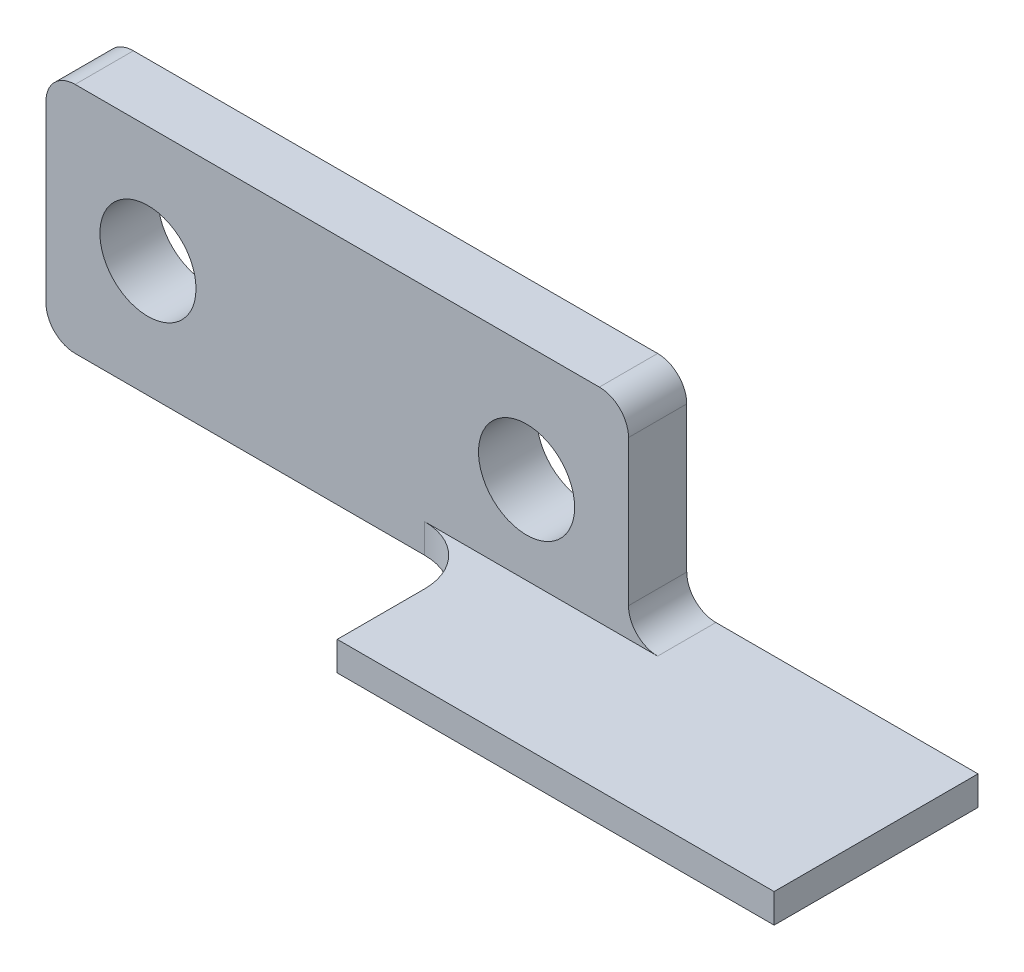
ISO-10303-21;
HEADER;
FILE_DESCRIPTION(('STEP AP214'),'2;1');
FILE_NAME('part.step','',(''),(''),'','','');
FILE_SCHEMA(('AUTOMOTIVE_DESIGN { 1 0 10303 214 1 1 1 1 }'));
ENDSEC;
DATA;
#1=APPLICATION_CONTEXT('core data for automotive mechanical design processes');
#2=APPLICATION_PROTOCOL_DEFINITION('international standard','automotive_design',2000,#1);
#3=PRODUCT_CONTEXT('',#1,'mechanical');
#4=PRODUCT('Part','Part','',(#3));
#5=PRODUCT_RELATED_PRODUCT_CATEGORY('part','',(#4));
#6=PRODUCT_DEFINITION_FORMATION('','',#4);
#7=PRODUCT_DEFINITION_CONTEXT('part definition',#1,'design');
#8=PRODUCT_DEFINITION('design','',#6,#7);
#9=PRODUCT_DEFINITION_SHAPE('','',#8);
#10=(LENGTH_UNIT() NAMED_UNIT(*) SI_UNIT(.MILLI.,.METRE.));
#11=(NAMED_UNIT(*) PLANE_ANGLE_UNIT() SI_UNIT($,.RADIAN.));
#12=(NAMED_UNIT(*) SI_UNIT($,.STERADIAN.) SOLID_ANGLE_UNIT());
#13=UNCERTAINTY_MEASURE_WITH_UNIT(LENGTH_MEASURE(1.E-05),#10,'distance_accuracy_value','');
#14=(GEOMETRIC_REPRESENTATION_CONTEXT(3) GLOBAL_UNCERTAINTY_ASSIGNED_CONTEXT((#13)) GLOBAL_UNIT_ASSIGNED_CONTEXT((#10,
#11,#12)) REPRESENTATION_CONTEXT('',''));
#15=CARTESIAN_POINT('',(0.,0.,0.));
#16=DIRECTION('',(0.,0.,1.));
#17=DIRECTION('',(1.,0.,0.));
#18=AXIS2_PLACEMENT_3D('',#15,#16,#17);
#19=CARTESIAN_POINT('',(0.,0.,2.));
#20=DIRECTION('',(1.,0.,0.));
#21=DIRECTION('',(0.,0.,-1.));
#22=AXIS2_PLACEMENT_3D('',#19,#20,#21);
#23=PLANE('',#22);
#24=DIRECTION('',(0.,-1.,0.));
#25=VECTOR('',#24,1.);
#26=CARTESIAN_POINT('',(0.,0.,2.));
#27=LINE('',#26,#25);
#28=CARTESIAN_POINT('',(0.,7.,2.));
#29=VERTEX_POINT('',#28);
#30=CARTESIAN_POINT('',(0.,1.,2.));
#31=VERTEX_POINT('',#30);
#32=EDGE_CURVE('E168',#29,#31,#27,.T.);
#33=ORIENTED_EDGE('',*,*,#32,.F.);
#34=DIRECTION('',(0.,0.,-1.));
#35=VECTOR('',#34,1.);
#36=CARTESIAN_POINT('',(0.,7.,2.));
#37=LINE('',#36,#35);
#38=CARTESIAN_POINT('',(0.,7.,0.));
#39=VERTEX_POINT('',#38);
#40=EDGE_CURVE('E217',#29,#39,#37,.T.);
#41=ORIENTED_EDGE('',*,*,#40,.T.);
#42=DIRECTION('',(0.,-1.,0.));
#43=VECTOR('',#42,1.);
#44=CARTESIAN_POINT('',(0.,0.,0.));
#45=LINE('',#44,#43);
#46=CARTESIAN_POINT('',(0.,1.,0.));
#47=VERTEX_POINT('',#46);
#48=EDGE_CURVE('E167',#39,#47,#45,.T.);
#49=ORIENTED_EDGE('',*,*,#48,.T.);
#50=DIRECTION('',(0.,0.,-1.));
#51=VECTOR('',#50,1.);
#52=CARTESIAN_POINT('',(0.,1.,2.));
#53=LINE('',#52,#51);
#54=EDGE_CURVE('E215',#47,#31,#53,.F.);
#55=ORIENTED_EDGE('',*,*,#54,.T.);
#56=EDGE_LOOP('',(#33,#41,#49,#55));
#57=FACE_BOUND('',#56,.T.);
#58=ADVANCED_FACE('F31',(#57),#23,.F.);
#59=CARTESIAN_POINT('',(0.,0.,2.));
#60=DIRECTION('',(0.,1.,0.));
#61=DIRECTION('',(0.,0.,1.));
#62=AXIS2_PLACEMENT_3D('',#59,#60,#61);
#63=PLANE('',#62);
#64=DIRECTION('',(1.,0.,0.));
#65=VECTOR('',#64,1.);
#66=CARTESIAN_POINT('',(0.,0.,2.));
#67=LINE('',#66,#65);
#68=CARTESIAN_POINT('',(1.,0.,2.));
#69=VERTEX_POINT('',#68);
#70=CARTESIAN_POINT('',(13.,0.,2.));
#71=VERTEX_POINT('',#70);
#72=EDGE_CURVE('E171',#69,#71,#67,.T.);
#73=ORIENTED_EDGE('',*,*,#72,.F.);
#74=DIRECTION('',(0.,0.,-1.));
#75=VECTOR('',#74,1.);
#76=CARTESIAN_POINT('',(1.,0.,2.));
#77=LINE('',#76,#75);
#78=CARTESIAN_POINT('',(1.,0.,0.));
#79=VERTEX_POINT('',#78);
#80=EDGE_CURVE('E220',#69,#79,#77,.T.);
#81=ORIENTED_EDGE('',*,*,#80,.T.);
#82=DIRECTION('',(1.,0.,0.));
#83=VECTOR('',#82,1.);
#84=CARTESIAN_POINT('',(0.,0.,0.));
#85=LINE('',#84,#83);
#86=CARTESIAN_POINT('',(30.,0.,0.));
#87=VERTEX_POINT('',#86);
#88=EDGE_CURVE('E184',#79,#87,#85,.T.);
#89=ORIENTED_EDGE('',*,*,#88,.T.);
#90=DIRECTION('',(0.,0.,1.));
#91=VECTOR('',#90,1.);
#92=CARTESIAN_POINT('',(30.,0.,0.));
#93=LINE('',#92,#91);
#94=CARTESIAN_POINT('',(30.,0.,7.));
#95=VERTEX_POINT('',#94);
#96=EDGE_CURVE('E129',#87,#95,#93,.T.);
#97=ORIENTED_EDGE('',*,*,#96,.T.);
#98=DIRECTION('',(1.,0.,0.));
#99=VECTOR('',#98,1.);
#100=CARTESIAN_POINT('',(15.,0.,7.));
#101=LINE('',#100,#99);
#102=CARTESIAN_POINT('',(15.,0.,7.));
#103=VERTEX_POINT('',#102);
#104=EDGE_CURVE('E133',#103,#95,#101,.T.);
#105=ORIENTED_EDGE('',*,*,#104,.F.);
#106=DIRECTION('',(0.,0.,1.));
#107=VECTOR('',#106,1.);
#108=CARTESIAN_POINT('',(15.,0.,0.));
#109=LINE('',#108,#107);
#110=CARTESIAN_POINT('',(15.,0.,4.));
#111=VERTEX_POINT('',#110);
#112=EDGE_CURVE('E122',#111,#103,#109,.T.);
#113=ORIENTED_EDGE('',*,*,#112,.F.);
#114=CARTESIAN_POINT('',(13.,0.,4.));
#115=DIRECTION('',(0.,1.,0.));
#116=DIRECTION('',(0.,0.,1.));
#117=AXIS2_PLACEMENT_3D('',#114,#115,#116);
#118=CIRCLE('',#117,2.);
#119=EDGE_CURVE('E11',#111,#71,#118,.T.);
#120=ORIENTED_EDGE('',*,*,#119,.T.);
#121=EDGE_LOOP('',(#73,#81,#89,#97,#105,#113,#120));
#122=FACE_BOUND('',#121,.T.);
#123=ADVANCED_FACE('F135',(#122),#63,.F.);
#124=CARTESIAN_POINT('',(20.,0.,2.));
#125=DIRECTION('',(-1.,0.,0.));
#126=DIRECTION('',(0.,0.,1.));
#127=AXIS2_PLACEMENT_3D('',#124,#125,#126);
#128=PLANE('',#127);
#129=DIRECTION('',(0.,1.,0.));
#130=VECTOR('',#129,1.);
#131=CARTESIAN_POINT('',(20.,0.,2.));
#132=LINE('',#131,#130);
#133=CARTESIAN_POINT('',(20.,2.,2.));
#134=VERTEX_POINT('',#133);
#135=CARTESIAN_POINT('',(20.,7.,2.));
#136=VERTEX_POINT('',#135);
#137=EDGE_CURVE('E175',#134,#136,#132,.T.);
#138=ORIENTED_EDGE('',*,*,#137,.F.);
#139=DIRECTION('',(0.,0.,-1.));
#140=VECTOR('',#139,1.);
#141=CARTESIAN_POINT('',(20.,2.,2.));
#142=LINE('',#141,#140);
#143=CARTESIAN_POINT('',(20.,2.,0.));
#144=VERTEX_POINT('',#143);
#145=EDGE_CURVE('E192',#134,#144,#142,.T.);
#146=ORIENTED_EDGE('',*,*,#145,.T.);
#147=DIRECTION('',(0.,1.,0.));
#148=VECTOR('',#147,1.);
#149=CARTESIAN_POINT('',(20.,0.,0.));
#150=LINE('',#149,#148);
#151=CARTESIAN_POINT('',(20.,7.,0.));
#152=VERTEX_POINT('',#151);
#153=EDGE_CURVE('E186',#144,#152,#150,.T.);
#154=ORIENTED_EDGE('',*,*,#153,.T.);
#155=DIRECTION('',(0.,0.,-1.));
#156=VECTOR('',#155,1.);
#157=CARTESIAN_POINT('',(20.,7.,2.));
#158=LINE('',#157,#156);
#159=EDGE_CURVE('E181',#152,#136,#158,.F.);
#160=ORIENTED_EDGE('',*,*,#159,.T.);
#161=EDGE_LOOP('',(#138,#146,#154,#160));
#162=FACE_BOUND('',#161,.T.);
#163=ADVANCED_FACE('F263',(#162),#128,.F.);
#164=CARTESIAN_POINT('',(0.,8.,2.));
#165=DIRECTION('',(0.,-1.,0.));
#166=DIRECTION('',(0.,0.,-1.));
#167=AXIS2_PLACEMENT_3D('',#164,#165,#166);
#168=PLANE('',#167);
#169=DIRECTION('',(-1.,0.,0.));
#170=VECTOR('',#169,1.);
#171=CARTESIAN_POINT('',(0.,8.,2.));
#172=LINE('',#171,#170);
#173=CARTESIAN_POINT('',(19.,8.,2.));
#174=VERTEX_POINT('',#173);
#175=CARTESIAN_POINT('',(1.,8.,2.));
#176=VERTEX_POINT('',#175);
#177=EDGE_CURVE('E178',#174,#176,#172,.T.);
#178=ORIENTED_EDGE('',*,*,#177,.F.);
#179=DIRECTION('',(0.,0.,-1.));
#180=VECTOR('',#179,1.);
#181=CARTESIAN_POINT('',(19.,8.,2.));
#182=LINE('',#181,#180);
#183=CARTESIAN_POINT('',(19.,8.,0.));
#184=VERTEX_POINT('',#183);
#185=EDGE_CURVE('E200',#174,#184,#182,.T.);
#186=ORIENTED_EDGE('',*,*,#185,.T.);
#187=DIRECTION('',(-1.,0.,0.));
#188=VECTOR('',#187,1.);
#189=CARTESIAN_POINT('',(0.,8.,0.));
#190=LINE('',#189,#188);
#191=CARTESIAN_POINT('',(1.,8.,0.));
#192=VERTEX_POINT('',#191);
#193=EDGE_CURVE('E172',#184,#192,#190,.T.);
#194=ORIENTED_EDGE('',*,*,#193,.T.);
#195=DIRECTION('',(0.,0.,-1.));
#196=VECTOR('',#195,1.);
#197=CARTESIAN_POINT('',(1.,8.,2.));
#198=LINE('',#197,#196);
#199=EDGE_CURVE('E198',#192,#176,#198,.F.);
#200=ORIENTED_EDGE('',*,*,#199,.T.);
#201=EDGE_LOOP('',(#178,#186,#194,#200));
#202=FACE_BOUND('',#201,.T.);
#203=ADVANCED_FACE('F254',(#202),#168,.F.);
#204=CARTESIAN_POINT('',(0.,8.,2.));
#205=DIRECTION('',(0.,0.,-1.));
#206=DIRECTION('',(-1.,0.,0.));
#207=AXIS2_PLACEMENT_3D('',#204,#205,#206);
#208=PLANE('',#207);
#209=CARTESIAN_POINT('',(16.5,4.,2.));
#210=DIRECTION('',(0.,0.,1.));
#211=DIRECTION('',(1.,0.,0.));
#212=AXIS2_PLACEMENT_3D('',#209,#210,#211);
#213=CIRCLE('',#212,1.65);
#214=CARTESIAN_POINT('',(18.15,4.,2.));
#215=VERTEX_POINT('',#214);
#216=EDGE_CURVE('E422',#215,#215,#213,.T.);
#217=ORIENTED_EDGE('',*,*,#216,.F.);
#218=EDGE_LOOP('',(#217));
#219=FACE_BOUND('',#218,.T.);
#220=CARTESIAN_POINT('',(3.5,4.,2.));
#221=DIRECTION('',(0.,0.,1.));
#222=DIRECTION('',(1.,0.,0.));
#223=AXIS2_PLACEMENT_3D('',#220,#221,#222);
#224=CIRCLE('',#223,1.65);
#225=CARTESIAN_POINT('',(5.15,4.,2.));
#226=VERTEX_POINT('',#225);
#227=EDGE_CURVE('E149',#226,#226,#224,.T.);
#228=ORIENTED_EDGE('',*,*,#227,.F.);
#229=EDGE_LOOP('',(#228));
#230=FACE_BOUND('',#229,.T.);
#231=ORIENTED_EDGE('',*,*,#72,.T.);
#232=DIRECTION('',(0.,1.,0.));
#233=VECTOR('',#232,1.);
#234=CARTESIAN_POINT('',(13.,8.,2.));
#235=LINE('',#234,#233);
#236=CARTESIAN_POINT('',(13.,1.,2.));
#237=VERTEX_POINT('',#236);
#238=EDGE_CURVE('E227',#71,#237,#235,.T.);
#239=ORIENTED_EDGE('',*,*,#238,.T.);
#240=DIRECTION('',(1.,0.,0.));
#241=VECTOR('',#240,1.);
#242=CARTESIAN_POINT('',(0.,1.,2.));
#243=LINE('',#242,#241);
#244=CARTESIAN_POINT('',(21.,1.,2.));
#245=VERTEX_POINT('',#244);
#246=EDGE_CURVE('E162',#237,#245,#243,.T.);
#247=ORIENTED_EDGE('',*,*,#246,.T.);
#248=CARTESIAN_POINT('',(21.,2.,2.));
#249=DIRECTION('',(0.,0.,-1.));
#250=DIRECTION('',(-1.,0.,0.));
#251=AXIS2_PLACEMENT_3D('',#248,#249,#250);
#252=CIRCLE('',#251,1.);
#253=EDGE_CURVE('E225',#245,#134,#252,.T.);
#254=ORIENTED_EDGE('',*,*,#253,.T.);
#255=ORIENTED_EDGE('',*,*,#137,.T.);
#256=CARTESIAN_POINT('',(19.,7.,2.));
#257=DIRECTION('',(0.,0.,-1.));
#258=DIRECTION('',(-1.,0.,0.));
#259=AXIS2_PLACEMENT_3D('',#256,#257,#258);
#260=CIRCLE('',#259,1.);
#261=EDGE_CURVE('E213',#136,#174,#260,.F.);
#262=ORIENTED_EDGE('',*,*,#261,.T.);
#263=ORIENTED_EDGE('',*,*,#177,.T.);
#264=CARTESIAN_POINT('',(1.,7.,2.));
#265=DIRECTION('',(0.,0.,-1.));
#266=DIRECTION('',(-1.,0.,0.));
#267=AXIS2_PLACEMENT_3D('',#264,#265,#266);
#268=CIRCLE('',#267,1.);
#269=EDGE_CURVE('E211',#176,#29,#268,.F.);
#270=ORIENTED_EDGE('',*,*,#269,.T.);
#271=ORIENTED_EDGE('',*,*,#32,.T.);
#272=CARTESIAN_POINT('',(1.,1.,2.));
#273=DIRECTION('',(0.,0.,-1.));
#274=DIRECTION('',(-1.,0.,0.));
#275=AXIS2_PLACEMENT_3D('',#272,#273,#274);
#276=CIRCLE('',#275,1.);
#277=EDGE_CURVE('E209',#31,#69,#276,.F.);
#278=ORIENTED_EDGE('',*,*,#277,.T.);
#279=EDGE_LOOP('',(#231,#239,#247,#254,#255,#262,#263,#270,#271,#278));
#280=FACE_BOUND('',#279,.T.);
#281=ADVANCED_FACE('F232',(#219,#230,#280),#208,.F.);
#282=CARTESIAN_POINT('',(0.,8.,0.));
#283=DIRECTION('',(0.,0.,-1.));
#284=DIRECTION('',(-1.,0.,0.));
#285=AXIS2_PLACEMENT_3D('',#282,#283,#284);
#286=PLANE('',#285);
#287=CARTESIAN_POINT('',(16.5,4.,0.));
#288=DIRECTION('',(0.,0.,1.));
#289=DIRECTION('',(1.,0.,0.));
#290=AXIS2_PLACEMENT_3D('',#287,#288,#289);
#291=CIRCLE('',#290,1.65);
#292=CARTESIAN_POINT('',(18.15,4.,0.));
#293=VERTEX_POINT('',#292);
#294=EDGE_CURVE('E420',#293,#293,#291,.T.);
#295=ORIENTED_EDGE('',*,*,#294,.T.);
#296=EDGE_LOOP('',(#295));
#297=FACE_BOUND('',#296,.T.);
#298=CARTESIAN_POINT('',(3.5,4.,0.));
#299=DIRECTION('',(0.,0.,1.));
#300=DIRECTION('',(1.,0.,0.));
#301=AXIS2_PLACEMENT_3D('',#298,#299,#300);
#302=CIRCLE('',#301,1.65);
#303=CARTESIAN_POINT('',(5.15,4.,0.));
#304=VERTEX_POINT('',#303);
#305=EDGE_CURVE('E146',#304,#304,#302,.T.);
#306=ORIENTED_EDGE('',*,*,#305,.T.);
#307=EDGE_LOOP('',(#306));
#308=FACE_BOUND('',#307,.T.);
#309=ORIENTED_EDGE('',*,*,#193,.F.);
#310=CARTESIAN_POINT('',(19.,7.,0.));
#311=DIRECTION('',(0.,0.,-1.));
#312=DIRECTION('',(-1.,0.,0.));
#313=AXIS2_PLACEMENT_3D('',#310,#311,#312);
#314=CIRCLE('',#313,1.);
#315=EDGE_CURVE('E207',#184,#152,#314,.T.);
#316=ORIENTED_EDGE('',*,*,#315,.T.);
#317=ORIENTED_EDGE('',*,*,#153,.F.);
#318=CARTESIAN_POINT('',(21.,2.,0.));
#319=DIRECTION('',(0.,0.,-1.));
#320=DIRECTION('',(-1.,0.,0.));
#321=AXIS2_PLACEMENT_3D('',#318,#319,#320);
#322=CIRCLE('',#321,1.);
#323=CARTESIAN_POINT('',(21.,1.,0.));
#324=VERTEX_POINT('',#323);
#325=EDGE_CURVE('E223',#144,#324,#322,.F.);
#326=ORIENTED_EDGE('',*,*,#325,.T.);
#327=DIRECTION('',(-1.,0.,0.));
#328=VECTOR('',#327,1.);
#329=CARTESIAN_POINT('',(15.,1.,0.));
#330=LINE('',#329,#328);
#331=CARTESIAN_POINT('',(30.,1.,0.));
#332=VERTEX_POINT('',#331);
#333=EDGE_CURVE('E130',#332,#324,#330,.T.);
#334=ORIENTED_EDGE('',*,*,#333,.F.);
#335=DIRECTION('',(0.,1.,0.));
#336=VECTOR('',#335,1.);
#337=CARTESIAN_POINT('',(30.,0.,0.));
#338=LINE('',#337,#336);
#339=EDGE_CURVE('E155',#87,#332,#338,.T.);
#340=ORIENTED_EDGE('',*,*,#339,.F.);
#341=ORIENTED_EDGE('',*,*,#88,.F.);
#342=CARTESIAN_POINT('',(1.,1.,0.));
#343=DIRECTION('',(0.,0.,-1.));
#344=DIRECTION('',(-1.,0.,0.));
#345=AXIS2_PLACEMENT_3D('',#342,#343,#344);
#346=CIRCLE('',#345,1.);
#347=EDGE_CURVE('E203',#79,#47,#346,.T.);
#348=ORIENTED_EDGE('',*,*,#347,.T.);
#349=ORIENTED_EDGE('',*,*,#48,.F.);
#350=CARTESIAN_POINT('',(1.,7.,0.));
#351=DIRECTION('',(0.,0.,-1.));
#352=DIRECTION('',(-1.,0.,0.));
#353=AXIS2_PLACEMENT_3D('',#350,#351,#352);
#354=CIRCLE('',#353,1.);
#355=EDGE_CURVE('E205',#39,#192,#354,.T.);
#356=ORIENTED_EDGE('',*,*,#355,.T.);
#357=EDGE_LOOP('',(#309,#316,#317,#326,#334,#340,#341,#348,#349,#356));
#358=FACE_BOUND('',#357,.T.);
#359=ADVANCED_FACE('F243',(#297,#308,#358),#286,.T.);
#360=CARTESIAN_POINT('',(15.,0.,0.));
#361=DIRECTION('',(-1.,0.,0.));
#362=DIRECTION('',(0.,0.,1.));
#363=AXIS2_PLACEMENT_3D('',#360,#361,#362);
#364=PLANE('',#363);
#365=DIRECTION('',(0.,0.,1.));
#366=VECTOR('',#365,1.);
#367=CARTESIAN_POINT('',(15.,1.,0.));
#368=LINE('',#367,#366);
#369=CARTESIAN_POINT('',(15.,1.,4.));
#370=VERTEX_POINT('',#369);
#371=CARTESIAN_POINT('',(15.,1.,7.));
#372=VERTEX_POINT('',#371);
#373=EDGE_CURVE('E160',#370,#372,#368,.T.);
#374=ORIENTED_EDGE('',*,*,#373,.F.);
#375=DIRECTION('',(0.,1.,0.));
#376=VECTOR('',#375,1.);
#377=CARTESIAN_POINT('',(15.,0.,4.));
#378=LINE('',#377,#376);
#379=EDGE_CURVE('E52',#370,#111,#378,.F.);
#380=ORIENTED_EDGE('',*,*,#379,.T.);
#381=ORIENTED_EDGE('',*,*,#112,.T.);
#382=DIRECTION('',(0.,-1.,0.));
#383=VECTOR('',#382,1.);
#384=CARTESIAN_POINT('',(15.,0.,7.));
#385=LINE('',#384,#383);
#386=EDGE_CURVE('E126',#372,#103,#385,.T.);
#387=ORIENTED_EDGE('',*,*,#386,.F.);
#388=EDGE_LOOP('',(#374,#380,#381,#387));
#389=FACE_BOUND('',#388,.T.);
#390=ADVANCED_FACE('F124',(#389),#364,.T.);
#391=CARTESIAN_POINT('',(15.,1.,0.));
#392=DIRECTION('',(0.,1.,0.));
#393=DIRECTION('',(0.,0.,1.));
#394=AXIS2_PLACEMENT_3D('',#391,#392,#393);
#395=PLANE('',#394);
#396=ORIENTED_EDGE('',*,*,#333,.T.);
#397=DIRECTION('',(0.,0.,-1.));
#398=VECTOR('',#397,1.);
#399=CARTESIAN_POINT('',(21.,1.,0.));
#400=LINE('',#399,#398);
#401=EDGE_CURVE('E195',#324,#245,#400,.F.);
#402=ORIENTED_EDGE('',*,*,#401,.T.);
#403=ORIENTED_EDGE('',*,*,#246,.F.);
#404=CARTESIAN_POINT('',(13.,1.,4.));
#405=DIRECTION('',(0.,1.,0.));
#406=DIRECTION('',(0.,0.,1.));
#407=AXIS2_PLACEMENT_3D('',#404,#405,#406);
#408=CIRCLE('',#407,2.);
#409=EDGE_CURVE('E39',#237,#370,#408,.F.);
#410=ORIENTED_EDGE('',*,*,#409,.T.);
#411=ORIENTED_EDGE('',*,*,#373,.T.);
#412=DIRECTION('',(-1.,0.,0.));
#413=VECTOR('',#412,1.);
#414=CARTESIAN_POINT('',(15.,1.,7.));
#415=LINE('',#414,#413);
#416=CARTESIAN_POINT('',(30.,1.,7.));
#417=VERTEX_POINT('',#416);
#418=EDGE_CURVE('E145',#417,#372,#415,.T.);
#419=ORIENTED_EDGE('',*,*,#418,.F.);
#420=DIRECTION('',(0.,0.,1.));
#421=VECTOR('',#420,1.);
#422=CARTESIAN_POINT('',(30.,1.,0.));
#423=LINE('',#422,#421);
#424=EDGE_CURVE('E163',#332,#417,#423,.T.);
#425=ORIENTED_EDGE('',*,*,#424,.F.);
#426=EDGE_LOOP('',(#396,#402,#403,#410,#411,#419,#425));
#427=FACE_BOUND('',#426,.T.);
#428=ADVANCED_FACE('F270',(#427),#395,.T.);
#429=CARTESIAN_POINT('',(30.,0.,0.));
#430=DIRECTION('',(1.,0.,0.));
#431=DIRECTION('',(0.,0.,-1.));
#432=AXIS2_PLACEMENT_3D('',#429,#430,#431);
#433=PLANE('',#432);
#434=ORIENTED_EDGE('',*,*,#424,.T.);
#435=DIRECTION('',(0.,1.,0.));
#436=VECTOR('',#435,1.);
#437=CARTESIAN_POINT('',(30.,0.,7.));
#438=LINE('',#437,#436);
#439=EDGE_CURVE('E140',#95,#417,#438,.T.);
#440=ORIENTED_EDGE('',*,*,#439,.F.);
#441=ORIENTED_EDGE('',*,*,#96,.F.);
#442=ORIENTED_EDGE('',*,*,#339,.T.);
#443=EDGE_LOOP('',(#434,#440,#441,#442));
#444=FACE_BOUND('',#443,.T.);
#445=ADVANCED_FACE('F272',(#444),#433,.T.);
#446=CARTESIAN_POINT('',(15.,1.,7.));
#447=DIRECTION('',(0.,0.,-1.));
#448=DIRECTION('',(-1.,0.,0.));
#449=AXIS2_PLACEMENT_3D('',#446,#447,#448);
#450=PLANE('',#449);
#451=ORIENTED_EDGE('',*,*,#386,.T.);
#452=ORIENTED_EDGE('',*,*,#104,.T.);
#453=ORIENTED_EDGE('',*,*,#439,.T.);
#454=ORIENTED_EDGE('',*,*,#418,.T.);
#455=EDGE_LOOP('',(#451,#452,#453,#454));
#456=FACE_BOUND('',#455,.T.);
#457=ADVANCED_FACE('F143',(#456),#450,.F.);
#458=CARTESIAN_POINT('',(3.5,4.,0.));
#459=DIRECTION('',(0.,0.,1.));
#460=DIRECTION('',(1.,0.,0.));
#461=AXIS2_PLACEMENT_3D('',#458,#459,#460);
#462=CYLINDRICAL_SURFACE('',#461,1.65);
#463=ORIENTED_EDGE('',*,*,#305,.F.);
#464=EDGE_LOOP('',(#463));
#465=FACE_BOUND('',#464,.T.);
#466=ORIENTED_EDGE('',*,*,#227,.T.);
#467=EDGE_LOOP('',(#466));
#468=FACE_BOUND('',#467,.T.);
#469=ADVANCED_FACE('F279',(#465,#468),#462,.F.);
#470=CARTESIAN_POINT('',(16.5,4.,0.));
#471=DIRECTION('',(0.,0.,1.));
#472=DIRECTION('',(1.,0.,0.));
#473=AXIS2_PLACEMENT_3D('',#470,#471,#472);
#474=CYLINDRICAL_SURFACE('',#473,1.65);
#475=ORIENTED_EDGE('',*,*,#294,.F.);
#476=EDGE_LOOP('',(#475));
#477=FACE_BOUND('',#476,.T.);
#478=ORIENTED_EDGE('',*,*,#216,.T.);
#479=EDGE_LOOP('',(#478));
#480=FACE_BOUND('',#479,.T.);
#481=ADVANCED_FACE('F293',(#477,#480),#474,.F.);
#482=CARTESIAN_POINT('',(21.,2.,2.));
#483=DIRECTION('',(0.,0.,-1.));
#484=DIRECTION('',(-1.,0.,0.));
#485=AXIS2_PLACEMENT_3D('',#482,#483,#484);
#486=CYLINDRICAL_SURFACE('',#485,1.);
#487=ORIENTED_EDGE('',*,*,#253,.F.);
#488=ORIENTED_EDGE('',*,*,#401,.F.);
#489=ORIENTED_EDGE('',*,*,#325,.F.);
#490=ORIENTED_EDGE('',*,*,#145,.F.);
#491=EDGE_LOOP('',(#487,#488,#489,#490));
#492=FACE_BOUND('',#491,.T.);
#493=ADVANCED_FACE('F267',(#492),#486,.F.);
#494=CARTESIAN_POINT('',(19.,7.,2.));
#495=DIRECTION('',(0.,0.,-1.));
#496=DIRECTION('',(-1.,0.,0.));
#497=AXIS2_PLACEMENT_3D('',#494,#495,#496);
#498=CYLINDRICAL_SURFACE('',#497,1.);
#499=ORIENTED_EDGE('',*,*,#261,.F.);
#500=ORIENTED_EDGE('',*,*,#159,.F.);
#501=ORIENTED_EDGE('',*,*,#315,.F.);
#502=ORIENTED_EDGE('',*,*,#185,.F.);
#503=EDGE_LOOP('',(#499,#500,#501,#502));
#504=FACE_BOUND('',#503,.T.);
#505=ADVANCED_FACE('F258',(#504),#498,.T.);
#506=CARTESIAN_POINT('',(1.,7.,2.));
#507=DIRECTION('',(0.,0.,-1.));
#508=DIRECTION('',(-1.,0.,0.));
#509=AXIS2_PLACEMENT_3D('',#506,#507,#508);
#510=CYLINDRICAL_SURFACE('',#509,1.);
#511=ORIENTED_EDGE('',*,*,#269,.F.);
#512=ORIENTED_EDGE('',*,*,#199,.F.);
#513=ORIENTED_EDGE('',*,*,#355,.F.);
#514=ORIENTED_EDGE('',*,*,#40,.F.);
#515=EDGE_LOOP('',(#511,#512,#513,#514));
#516=FACE_BOUND('',#515,.T.);
#517=ADVANCED_FACE('F250',(#516),#510,.T.);
#518=CARTESIAN_POINT('',(1.,1.,2.));
#519=DIRECTION('',(0.,0.,-1.));
#520=DIRECTION('',(-1.,0.,0.));
#521=AXIS2_PLACEMENT_3D('',#518,#519,#520);
#522=CYLINDRICAL_SURFACE('',#521,1.);
#523=ORIENTED_EDGE('',*,*,#277,.F.);
#524=ORIENTED_EDGE('',*,*,#54,.F.);
#525=ORIENTED_EDGE('',*,*,#347,.F.);
#526=ORIENTED_EDGE('',*,*,#80,.F.);
#527=EDGE_LOOP('',(#523,#524,#525,#526));
#528=FACE_BOUND('',#527,.T.);
#529=ADVANCED_FACE('F238',(#528),#522,.T.);
#530=CARTESIAN_POINT('',(13.,8.,4.));
#531=DIRECTION('',(0.,1.,0.));
#532=DIRECTION('',(0.,0.,1.));
#533=AXIS2_PLACEMENT_3D('',#530,#531,#532);
#534=CYLINDRICAL_SURFACE('',#533,2.);
#535=ORIENTED_EDGE('',*,*,#119,.F.);
#536=ORIENTED_EDGE('',*,*,#379,.F.);
#537=ORIENTED_EDGE('',*,*,#409,.F.);
#538=ORIENTED_EDGE('',*,*,#238,.F.);
#539=EDGE_LOOP('',(#535,#536,#537,#538));
#540=FACE_BOUND('',#539,.T.);
#541=ADVANCED_FACE('F33',(#540),#534,.F.);
#542=CLOSED_SHELL('',(#58,#123,#163,#203,#281,#359,#390,#428,#445,#457,#469,#481,#493,#505,#517,
#529,#541));
#543=MANIFOLD_SOLID_BREP('B2',#542);
#544=ADVANCED_BREP_SHAPE_REPRESENTATION('',(#18,#543),#14);
#545=SHAPE_DEFINITION_REPRESENTATION(#9,#544);
ENDSEC;
END-ISO-10303-21;
